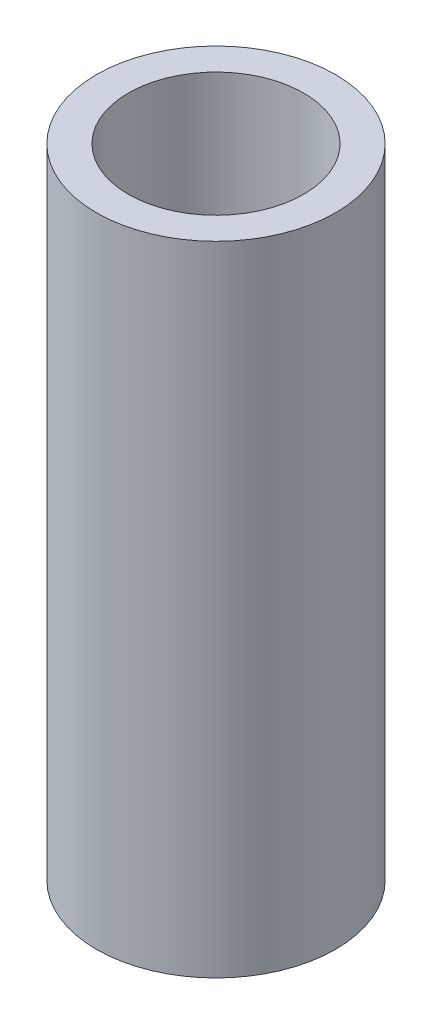
ISO-10303-21;
HEADER;
FILE_DESCRIPTION(('STEP AP214'),'2;1');
FILE_NAME('part.step','',(''),(''),'','','');
FILE_SCHEMA(('AUTOMOTIVE_DESIGN { 1 0 10303 214 1 1 1 1 }'));
ENDSEC;
DATA;
#1=APPLICATION_CONTEXT('core data for automotive mechanical design processes');
#2=APPLICATION_PROTOCOL_DEFINITION('international standard','automotive_design',2000,#1);
#3=PRODUCT_CONTEXT('',#1,'mechanical');
#4=PRODUCT('Part','Part','',(#3));
#5=PRODUCT_RELATED_PRODUCT_CATEGORY('part','',(#4));
#6=PRODUCT_DEFINITION_FORMATION('','',#4);
#7=PRODUCT_DEFINITION_CONTEXT('part definition',#1,'design');
#8=PRODUCT_DEFINITION('design','',#6,#7);
#9=PRODUCT_DEFINITION_SHAPE('','',#8);
#10=(LENGTH_UNIT() NAMED_UNIT(*) SI_UNIT(.MILLI.,.METRE.));
#11=(NAMED_UNIT(*) PLANE_ANGLE_UNIT() SI_UNIT($,.RADIAN.));
#12=(NAMED_UNIT(*) SI_UNIT($,.STERADIAN.) SOLID_ANGLE_UNIT());
#13=UNCERTAINTY_MEASURE_WITH_UNIT(LENGTH_MEASURE(1.E-05),#10,'distance_accuracy_value','');
#14=(GEOMETRIC_REPRESENTATION_CONTEXT(3) GLOBAL_UNCERTAINTY_ASSIGNED_CONTEXT((#13)) GLOBAL_UNIT_ASSIGNED_CONTEXT((#10,
#11,#12)) REPRESENTATION_CONTEXT('',''));
#15=CARTESIAN_POINT('',(0.,0.,0.));
#16=DIRECTION('',(0.,0.,1.));
#17=DIRECTION('',(1.,0.,0.));
#18=AXIS2_PLACEMENT_3D('',#15,#16,#17);
#19=CARTESIAN_POINT('',(0.,20.,0.));
#20=DIRECTION('',(0.,1.,0.));
#21=DIRECTION('',(0.,0.,1.));
#22=AXIS2_PLACEMENT_3D('',#19,#20,#21);
#23=PLANE('',#22);
#24=CARTESIAN_POINT('',(0.,20.,0.));
#25=DIRECTION('',(0.,1.,0.));
#26=DIRECTION('',(0.,0.,1.));
#27=AXIS2_PLACEMENT_3D('',#24,#25,#26);
#28=CIRCLE('',#27,3.75);
#29=CARTESIAN_POINT('',(0.,20.,3.75));
#30=VERTEX_POINT('',#29);
#31=EDGE_CURVE('E10',#30,#30,#28,.T.);
#32=ORIENTED_EDGE('',*,*,#31,.T.);
#33=EDGE_LOOP('',(#32));
#34=FACE_BOUND('',#33,.T.);
#35=CARTESIAN_POINT('',(0.,20.,0.));
#36=DIRECTION('',(0.,1.,0.));
#37=DIRECTION('',(0.,0.,1.));
#38=AXIS2_PLACEMENT_3D('',#35,#36,#37);
#39=CIRCLE('',#38,2.75);
#40=CARTESIAN_POINT('',(0.,20.,2.75));
#41=VERTEX_POINT('',#40);
#42=EDGE_CURVE('E42',#41,#41,#39,.T.);
#43=ORIENTED_EDGE('',*,*,#42,.F.);
#44=EDGE_LOOP('',(#43));
#45=FACE_BOUND('',#44,.T.);
#46=ADVANCED_FACE('F31',(#34,#45),#23,.T.);
#47=CARTESIAN_POINT('',(0.,0.,0.));
#48=DIRECTION('',(0.,1.,0.));
#49=DIRECTION('',(0.,0.,1.));
#50=AXIS2_PLACEMENT_3D('',#47,#48,#49);
#51=PLANE('',#50);
#52=CARTESIAN_POINT('',(0.,0.,0.));
#53=DIRECTION('',(0.,1.,0.));
#54=DIRECTION('',(0.,0.,1.));
#55=AXIS2_PLACEMENT_3D('',#52,#53,#54);
#56=CIRCLE('',#55,3.75);
#57=CARTESIAN_POINT('',(0.,0.,3.75));
#58=VERTEX_POINT('',#57);
#59=EDGE_CURVE('E35',#58,#58,#56,.T.);
#60=ORIENTED_EDGE('',*,*,#59,.F.);
#61=EDGE_LOOP('',(#60));
#62=FACE_BOUND('',#61,.T.);
#63=CARTESIAN_POINT('',(0.,0.,0.));
#64=DIRECTION('',(0.,1.,0.));
#65=DIRECTION('',(0.,0.,1.));
#66=AXIS2_PLACEMENT_3D('',#63,#64,#65);
#67=CIRCLE('',#66,2.75);
#68=CARTESIAN_POINT('',(0.,0.,2.75));
#69=VERTEX_POINT('',#68);
#70=EDGE_CURVE('E44',#69,#69,#67,.T.);
#71=ORIENTED_EDGE('',*,*,#70,.T.);
#72=EDGE_LOOP('',(#71));
#73=FACE_BOUND('',#72,.T.);
#74=ADVANCED_FACE('F54',(#62,#73),#51,.F.);
#75=CARTESIAN_POINT('',(0.,20.,0.));
#76=DIRECTION('',(0.,-1.,0.));
#77=DIRECTION('',(0.,0.,-1.));
#78=AXIS2_PLACEMENT_3D('',#75,#76,#77);
#79=CYLINDRICAL_SURFACE('',#78,3.75);
#80=ORIENTED_EDGE('',*,*,#31,.F.);
#81=EDGE_LOOP('',(#80));
#82=FACE_BOUND('',#81,.T.);
#83=ORIENTED_EDGE('',*,*,#59,.T.);
#84=EDGE_LOOP('',(#83));
#85=FACE_BOUND('',#84,.T.);
#86=ADVANCED_FACE('F33',(#82,#85),#79,.T.);
#87=CARTESIAN_POINT('',(0.,20.,0.));
#88=DIRECTION('',(0.,-1.,0.));
#89=DIRECTION('',(0.,0.,-1.));
#90=AXIS2_PLACEMENT_3D('',#87,#88,#89);
#91=CYLINDRICAL_SURFACE('',#90,2.75);
#92=ORIENTED_EDGE('',*,*,#42,.T.);
#93=EDGE_LOOP('',(#92));
#94=FACE_BOUND('',#93,.T.);
#95=ORIENTED_EDGE('',*,*,#70,.F.);
#96=EDGE_LOOP('',(#95));
#97=FACE_BOUND('',#96,.T.);
#98=ADVANCED_FACE('F50',(#94,#97),#91,.F.);
#99=CLOSED_SHELL('',(#46,#74,#86,#98));
#100=MANIFOLD_SOLID_BREP('B2',#99);
#101=ADVANCED_BREP_SHAPE_REPRESENTATION('',(#18,#100),#14);
#102=SHAPE_DEFINITION_REPRESENTATION(#9,#101);
ENDSEC;
END-ISO-10303-21;
